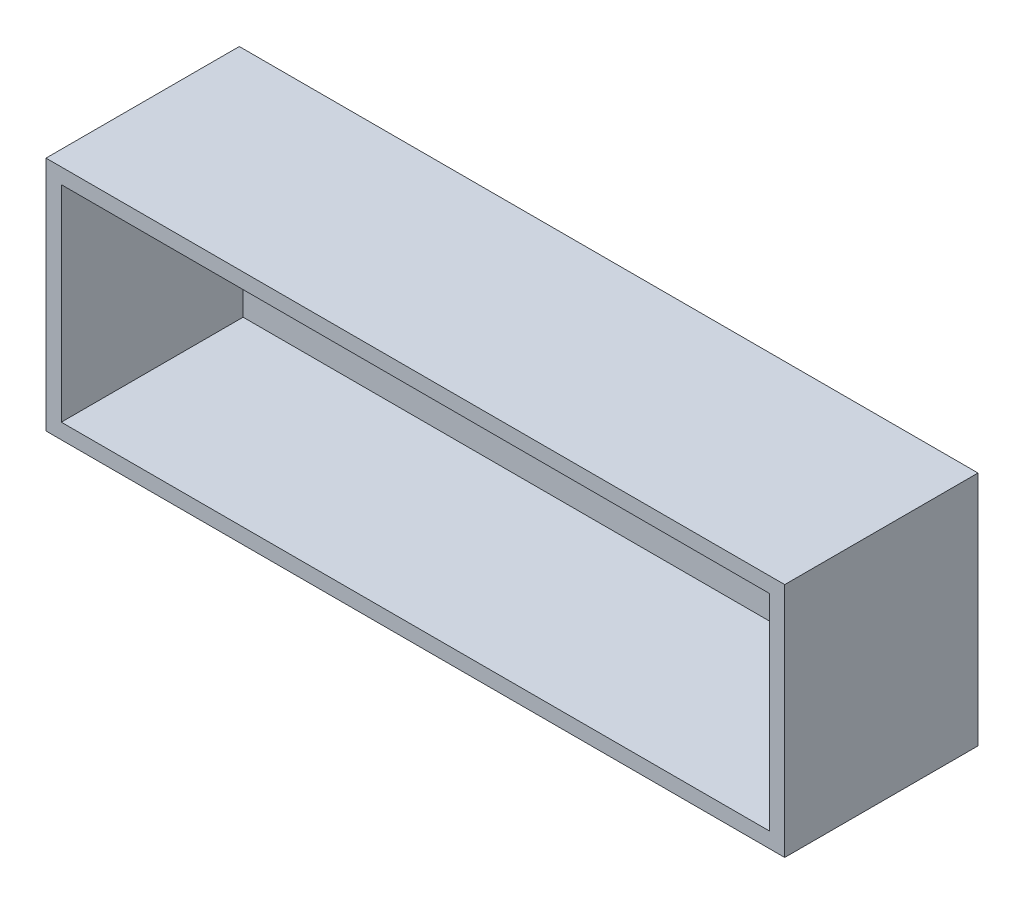
ISO-10303-21;
HEADER;
FILE_DESCRIPTION(('STEP AP214'),'2;1');
FILE_NAME('part.step','',(''),(''),'','','');
FILE_SCHEMA(('AUTOMOTIVE_DESIGN { 1 0 10303 214 1 1 1 1 }'));
ENDSEC;
DATA;
#1=APPLICATION_CONTEXT('core data for automotive mechanical design processes');
#2=APPLICATION_PROTOCOL_DEFINITION('international standard','automotive_design',2000,#1);
#3=PRODUCT_CONTEXT('',#1,'mechanical');
#4=PRODUCT('Part','Part','',(#3));
#5=PRODUCT_RELATED_PRODUCT_CATEGORY('part','',(#4));
#6=PRODUCT_DEFINITION_FORMATION('','',#4);
#7=PRODUCT_DEFINITION_CONTEXT('part definition',#1,'design');
#8=PRODUCT_DEFINITION('design','',#6,#7);
#9=PRODUCT_DEFINITION_SHAPE('','',#8);
#10=(LENGTH_UNIT() NAMED_UNIT(*) SI_UNIT(.MILLI.,.METRE.));
#11=(NAMED_UNIT(*) PLANE_ANGLE_UNIT() SI_UNIT($,.RADIAN.));
#12=(NAMED_UNIT(*) SI_UNIT($,.STERADIAN.) SOLID_ANGLE_UNIT());
#13=UNCERTAINTY_MEASURE_WITH_UNIT(LENGTH_MEASURE(1.E-05),#10,'distance_accuracy_value','');
#14=(GEOMETRIC_REPRESENTATION_CONTEXT(3) GLOBAL_UNCERTAINTY_ASSIGNED_CONTEXT((#13)) GLOBAL_UNIT_ASSIGNED_CONTEXT((#10,
#11,#12)) REPRESENTATION_CONTEXT('',''));
#15=CARTESIAN_POINT('',(0.,0.,0.));
#16=DIRECTION('',(0.,0.,1.));
#17=DIRECTION('',(1.,0.,0.));
#18=AXIS2_PLACEMENT_3D('',#15,#16,#17);
#19=CARTESIAN_POINT('',(0.,0.,19.));
#20=DIRECTION('',(0.,0.,-1.));
#21=DIRECTION('',(-1.,0.,0.));
#22=AXIS2_PLACEMENT_3D('',#19,#20,#21);
#23=PLANE('',#22);
#24=DIRECTION('',(0.,1.,0.));
#25=VECTOR('',#24,1.);
#26=CARTESIAN_POINT('',(38.6,-12.35,19.));
#27=LINE('',#26,#25);
#28=CARTESIAN_POINT('',(38.6,-12.35,19.));
#29=VERTEX_POINT('',#28);
#30=CARTESIAN_POINT('',(38.6,12.35,19.));
#31=VERTEX_POINT('',#30);
#32=EDGE_CURVE('E105',#29,#31,#27,.T.);
#33=ORIENTED_EDGE('',*,*,#32,.T.);
#34=DIRECTION('',(-1.,0.,0.));
#35=VECTOR('',#34,1.);
#36=CARTESIAN_POINT('',(-38.6,12.35,19.));
#37=LINE('',#36,#35);
#38=CARTESIAN_POINT('',(-38.6,12.35,19.));
#39=VERTEX_POINT('',#38);
#40=EDGE_CURVE('E155',#31,#39,#37,.T.);
#41=ORIENTED_EDGE('',*,*,#40,.T.);
#42=DIRECTION('',(0.,-1.,0.));
#43=VECTOR('',#42,1.);
#44=CARTESIAN_POINT('',(-38.6,-12.35,19.));
#45=LINE('',#44,#43);
#46=CARTESIAN_POINT('',(-38.6,-12.35,19.));
#47=VERTEX_POINT('',#46);
#48=EDGE_CURVE('E157',#39,#47,#45,.T.);
#49=ORIENTED_EDGE('',*,*,#48,.T.);
#50=DIRECTION('',(1.,0.,0.));
#51=VECTOR('',#50,1.);
#52=CARTESIAN_POINT('',(-38.6,-12.35,19.));
#53=LINE('',#52,#51);
#54=EDGE_CURVE('E110',#47,#29,#53,.T.);
#55=ORIENTED_EDGE('',*,*,#54,.T.);
#56=EDGE_LOOP('',(#33,#41,#49,#55));
#57=FACE_BOUND('',#56,.T.);
#58=DIRECTION('',(0.,1.,0.));
#59=VECTOR('',#58,1.);
#60=CARTESIAN_POINT('',(37.,-10.75,19.));
#61=LINE('',#60,#59);
#62=CARTESIAN_POINT('',(37.,-10.75,19.));
#63=VERTEX_POINT('',#62);
#64=CARTESIAN_POINT('',(37.,10.75,19.));
#65=VERTEX_POINT('',#64);
#66=EDGE_CURVE('E129',#63,#65,#61,.T.);
#67=ORIENTED_EDGE('',*,*,#66,.F.);
#68=DIRECTION('',(1.,0.,0.));
#69=VECTOR('',#68,1.);
#70=CARTESIAN_POINT('',(-37.,-10.75,19.));
#71=LINE('',#70,#69);
#72=CARTESIAN_POINT('',(-37.,-10.75,19.));
#73=VERTEX_POINT('',#72);
#74=EDGE_CURVE('E136',#73,#63,#71,.T.);
#75=ORIENTED_EDGE('',*,*,#74,.F.);
#76=DIRECTION('',(0.,-1.,0.));
#77=VECTOR('',#76,1.);
#78=CARTESIAN_POINT('',(-37.,-10.75,19.));
#79=LINE('',#78,#77);
#80=CARTESIAN_POINT('',(-37.,10.75,19.));
#81=VERTEX_POINT('',#80);
#82=EDGE_CURVE('E134',#81,#73,#79,.T.);
#83=ORIENTED_EDGE('',*,*,#82,.F.);
#84=DIRECTION('',(-1.,0.,0.));
#85=VECTOR('',#84,1.);
#86=CARTESIAN_POINT('',(-37.,10.75,19.));
#87=LINE('',#86,#85);
#88=EDGE_CURVE('E131',#65,#81,#87,.T.);
#89=ORIENTED_EDGE('',*,*,#88,.F.);
#90=EDGE_LOOP('',(#67,#75,#83,#89));
#91=FACE_BOUND('',#90,.T.);
#92=ADVANCED_FACE('F33',(#57,#91),#23,.F.);
#93=CARTESIAN_POINT('',(38.6,-12.35,19.));
#94=DIRECTION('',(-1.,0.,0.));
#95=DIRECTION('',(0.,0.,1.));
#96=AXIS2_PLACEMENT_3D('',#93,#94,#95);
#97=PLANE('',#96);
#98=DIRECTION('',(0.,0.,-1.));
#99=VECTOR('',#98,1.);
#100=CARTESIAN_POINT('',(38.6,-12.35,19.));
#101=LINE('',#100,#99);
#102=CARTESIAN_POINT('',(38.6,-12.35,-1.2));
#103=VERTEX_POINT('',#102);
#104=EDGE_CURVE('E100',#29,#103,#101,.T.);
#105=ORIENTED_EDGE('',*,*,#104,.T.);
#106=DIRECTION('',(0.,1.,0.));
#107=VECTOR('',#106,1.);
#108=CARTESIAN_POINT('',(38.6,0.,-1.2));
#109=LINE('',#108,#107);
#110=CARTESIAN_POINT('',(38.6,12.35,-1.2));
#111=VERTEX_POINT('',#110);
#112=EDGE_CURVE('E103',#103,#111,#109,.T.);
#113=ORIENTED_EDGE('',*,*,#112,.T.);
#114=DIRECTION('',(0.,0.,-1.));
#115=VECTOR('',#114,1.);
#116=CARTESIAN_POINT('',(38.6,12.35,19.));
#117=LINE('',#116,#115);
#118=EDGE_CURVE('E11',#31,#111,#117,.T.);
#119=ORIENTED_EDGE('',*,*,#118,.F.);
#120=ORIENTED_EDGE('',*,*,#32,.F.);
#121=EDGE_LOOP('',(#105,#113,#119,#120));
#122=FACE_BOUND('',#121,.T.);
#123=ADVANCED_FACE('F35',(#122),#97,.F.);
#124=CARTESIAN_POINT('',(-38.6,12.35,19.));
#125=DIRECTION('',(0.,-1.,0.));
#126=DIRECTION('',(0.,0.,-1.));
#127=AXIS2_PLACEMENT_3D('',#124,#125,#126);
#128=PLANE('',#127);
#129=ORIENTED_EDGE('',*,*,#118,.T.);
#130=DIRECTION('',(1.,0.,0.));
#131=VECTOR('',#130,1.);
#132=CARTESIAN_POINT('',(0.,12.35,-1.2));
#133=LINE('',#132,#131);
#134=CARTESIAN_POINT('',(-38.6,12.35,-1.2));
#135=VERTEX_POINT('',#134);
#136=EDGE_CURVE('E119',#135,#111,#133,.T.);
#137=ORIENTED_EDGE('',*,*,#136,.F.);
#138=DIRECTION('',(0.,0.,-1.));
#139=VECTOR('',#138,1.);
#140=CARTESIAN_POINT('',(-38.6,12.35,19.));
#141=LINE('',#140,#139);
#142=EDGE_CURVE('E41',#39,#135,#141,.T.);
#143=ORIENTED_EDGE('',*,*,#142,.F.);
#144=ORIENTED_EDGE('',*,*,#40,.F.);
#145=EDGE_LOOP('',(#129,#137,#143,#144));
#146=FACE_BOUND('',#145,.T.);
#147=ADVANCED_FACE('F165',(#146),#128,.F.);
#148=CARTESIAN_POINT('',(-38.6,-12.35,19.));
#149=DIRECTION('',(1.,0.,0.));
#150=DIRECTION('',(0.,0.,-1.));
#151=AXIS2_PLACEMENT_3D('',#148,#149,#150);
#152=PLANE('',#151);
#153=ORIENTED_EDGE('',*,*,#142,.T.);
#154=DIRECTION('',(0.,1.,0.));
#155=VECTOR('',#154,1.);
#156=CARTESIAN_POINT('',(-38.6,0.,-1.2));
#157=LINE('',#156,#155);
#158=CARTESIAN_POINT('',(-38.6,-12.35,-1.2));
#159=VERTEX_POINT('',#158);
#160=EDGE_CURVE('E127',#159,#135,#157,.T.);
#161=ORIENTED_EDGE('',*,*,#160,.F.);
#162=DIRECTION('',(0.,0.,-1.));
#163=VECTOR('',#162,1.);
#164=CARTESIAN_POINT('',(-38.6,-12.35,19.));
#165=LINE('',#164,#163);
#166=EDGE_CURVE('E109',#47,#159,#165,.T.);
#167=ORIENTED_EDGE('',*,*,#166,.F.);
#168=ORIENTED_EDGE('',*,*,#48,.F.);
#169=EDGE_LOOP('',(#153,#161,#167,#168));
#170=FACE_BOUND('',#169,.T.);
#171=ADVANCED_FACE('F163',(#170),#152,.F.);
#172=CARTESIAN_POINT('',(-38.6,-12.35,19.));
#173=DIRECTION('',(0.,1.,0.));
#174=DIRECTION('',(0.,0.,1.));
#175=AXIS2_PLACEMENT_3D('',#172,#173,#174);
#176=PLANE('',#175);
#177=ORIENTED_EDGE('',*,*,#166,.T.);
#178=DIRECTION('',(1.,0.,0.));
#179=VECTOR('',#178,1.);
#180=CARTESIAN_POINT('',(0.,-12.35,-1.2));
#181=LINE('',#180,#179);
#182=EDGE_CURVE('E117',#159,#103,#181,.T.);
#183=ORIENTED_EDGE('',*,*,#182,.T.);
#184=ORIENTED_EDGE('',*,*,#104,.F.);
#185=ORIENTED_EDGE('',*,*,#54,.F.);
#186=EDGE_LOOP('',(#177,#183,#184,#185));
#187=FACE_BOUND('',#186,.T.);
#188=ADVANCED_FACE('F121',(#187),#176,.F.);
#189=CARTESIAN_POINT('',(37.,-10.75,19.));
#190=DIRECTION('',(-1.,0.,0.));
#191=DIRECTION('',(0.,0.,1.));
#192=AXIS2_PLACEMENT_3D('',#189,#190,#191);
#193=PLANE('',#192);
#194=DIRECTION('',(0.,1.,0.));
#195=VECTOR('',#194,1.);
#196=CARTESIAN_POINT('',(37.,-10.75,0.));
#197=LINE('',#196,#195);
#198=CARTESIAN_POINT('',(37.,-10.75,0.));
#199=VERTEX_POINT('',#198);
#200=CARTESIAN_POINT('',(37.,10.75,0.));
#201=VERTEX_POINT('',#200);
#202=EDGE_CURVE('E56',#199,#201,#197,.T.);
#203=ORIENTED_EDGE('',*,*,#202,.F.);
#204=DIRECTION('',(0.,0.,-1.));
#205=VECTOR('',#204,1.);
#206=CARTESIAN_POINT('',(37.,-10.75,19.));
#207=LINE('',#206,#205);
#208=EDGE_CURVE('E138',#63,#199,#207,.T.);
#209=ORIENTED_EDGE('',*,*,#208,.F.);
#210=ORIENTED_EDGE('',*,*,#66,.T.);
#211=DIRECTION('',(0.,0.,-1.));
#212=VECTOR('',#211,1.);
#213=CARTESIAN_POINT('',(37.,10.75,19.));
#214=LINE('',#213,#212);
#215=EDGE_CURVE('E152',#65,#201,#214,.T.);
#216=ORIENTED_EDGE('',*,*,#215,.T.);
#217=EDGE_LOOP('',(#203,#209,#210,#216));
#218=FACE_BOUND('',#217,.T.);
#219=ADVANCED_FACE('F175',(#218),#193,.T.);
#220=CARTESIAN_POINT('',(-37.,10.75,19.));
#221=DIRECTION('',(0.,-1.,0.));
#222=DIRECTION('',(0.,0.,-1.));
#223=AXIS2_PLACEMENT_3D('',#220,#221,#222);
#224=PLANE('',#223);
#225=DIRECTION('',(-1.,0.,0.));
#226=VECTOR('',#225,1.);
#227=CARTESIAN_POINT('',(-37.,10.75,0.));
#228=LINE('',#227,#226);
#229=CARTESIAN_POINT('',(-37.,10.75,0.));
#230=VERTEX_POINT('',#229);
#231=EDGE_CURVE('E140',#201,#230,#228,.T.);
#232=ORIENTED_EDGE('',*,*,#231,.F.);
#233=ORIENTED_EDGE('',*,*,#215,.F.);
#234=ORIENTED_EDGE('',*,*,#88,.T.);
#235=DIRECTION('',(0.,0.,-1.));
#236=VECTOR('',#235,1.);
#237=CARTESIAN_POINT('',(-37.,10.75,19.));
#238=LINE('',#237,#236);
#239=EDGE_CURVE('E150',#81,#230,#238,.T.);
#240=ORIENTED_EDGE('',*,*,#239,.T.);
#241=EDGE_LOOP('',(#232,#233,#234,#240));
#242=FACE_BOUND('',#241,.T.);
#243=ADVANCED_FACE('F177',(#242),#224,.T.);
#244=CARTESIAN_POINT('',(-37.,-10.75,19.));
#245=DIRECTION('',(1.,0.,0.));
#246=DIRECTION('',(0.,0.,-1.));
#247=AXIS2_PLACEMENT_3D('',#244,#245,#246);
#248=PLANE('',#247);
#249=DIRECTION('',(0.,-1.,0.));
#250=VECTOR('',#249,1.);
#251=CARTESIAN_POINT('',(-37.,-10.75,0.));
#252=LINE('',#251,#250);
#253=CARTESIAN_POINT('',(-37.,-10.75,0.));
#254=VERTEX_POINT('',#253);
#255=EDGE_CURVE('E143',#230,#254,#252,.T.);
#256=ORIENTED_EDGE('',*,*,#255,.F.);
#257=ORIENTED_EDGE('',*,*,#239,.F.);
#258=ORIENTED_EDGE('',*,*,#82,.T.);
#259=DIRECTION('',(0.,0.,-1.));
#260=VECTOR('',#259,1.);
#261=CARTESIAN_POINT('',(-37.,-10.75,19.));
#262=LINE('',#261,#260);
#263=EDGE_CURVE('E48',#73,#254,#262,.T.);
#264=ORIENTED_EDGE('',*,*,#263,.T.);
#265=EDGE_LOOP('',(#256,#257,#258,#264));
#266=FACE_BOUND('',#265,.T.);
#267=ADVANCED_FACE('F184',(#266),#248,.T.);
#268=CARTESIAN_POINT('',(-37.,-10.75,19.));
#269=DIRECTION('',(0.,1.,0.));
#270=DIRECTION('',(0.,0.,1.));
#271=AXIS2_PLACEMENT_3D('',#268,#269,#270);
#272=PLANE('',#271);
#273=DIRECTION('',(1.,0.,0.));
#274=VECTOR('',#273,1.);
#275=CARTESIAN_POINT('',(-37.,-10.75,0.));
#276=LINE('',#275,#274);
#277=EDGE_CURVE('E132',#254,#199,#276,.T.);
#278=ORIENTED_EDGE('',*,*,#277,.F.);
#279=ORIENTED_EDGE('',*,*,#263,.F.);
#280=ORIENTED_EDGE('',*,*,#74,.T.);
#281=ORIENTED_EDGE('',*,*,#208,.T.);
#282=EDGE_LOOP('',(#278,#279,#280,#281));
#283=FACE_BOUND('',#282,.T.);
#284=ADVANCED_FACE('F182',(#283),#272,.T.);
#285=CARTESIAN_POINT('',(0.,0.,0.));
#286=DIRECTION('',(0.,0.,1.));
#287=DIRECTION('',(1.,0.,0.));
#288=AXIS2_PLACEMENT_3D('',#285,#286,#287);
#289=PLANE('',#288);
#290=ORIENTED_EDGE('',*,*,#255,.T.);
#291=ORIENTED_EDGE('',*,*,#277,.T.);
#292=ORIENTED_EDGE('',*,*,#202,.T.);
#293=ORIENTED_EDGE('',*,*,#231,.T.);
#294=EDGE_LOOP('',(#290,#291,#292,#293));
#295=FACE_BOUND('',#294,.T.);
#296=ADVANCED_FACE('F181',(#295),#289,.T.);
#297=CARTESIAN_POINT('',(0.,0.,-1.2));
#298=DIRECTION('',(0.,0.,1.));
#299=DIRECTION('',(1.,0.,0.));
#300=AXIS2_PLACEMENT_3D('',#297,#298,#299);
#301=PLANE('',#300);
#302=ORIENTED_EDGE('',*,*,#182,.F.);
#303=ORIENTED_EDGE('',*,*,#160,.T.);
#304=ORIENTED_EDGE('',*,*,#136,.T.);
#305=ORIENTED_EDGE('',*,*,#112,.F.);
#306=EDGE_LOOP('',(#302,#303,#304,#305));
#307=FACE_BOUND('',#306,.T.);
#308=ADVANCED_FACE('F115',(#307),#301,.F.);
#309=CLOSED_SHELL('',(#92,#123,#147,#171,#188,#219,#243,#267,#284,#296,#308));
#310=MANIFOLD_SOLID_BREP('B2',#309);
#311=ADVANCED_BREP_SHAPE_REPRESENTATION('',(#18,#310),#14);
#312=SHAPE_DEFINITION_REPRESENTATION(#9,#311);
ENDSEC;
END-ISO-10303-21;
